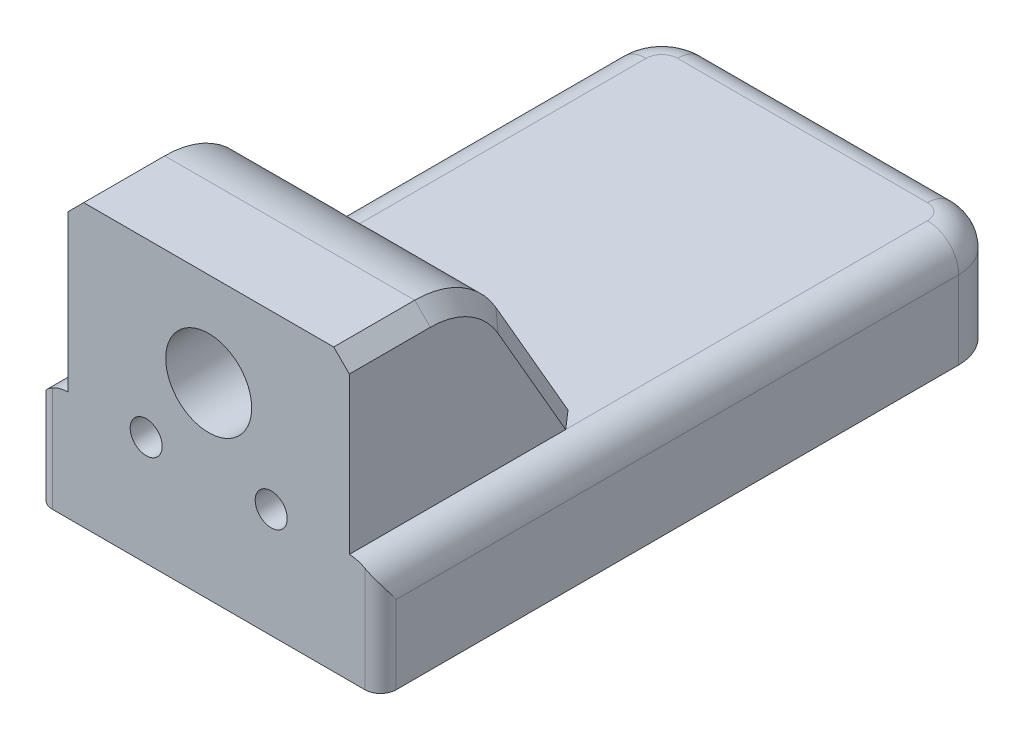
ISO-10303-21;
HEADER;
FILE_DESCRIPTION(('STEP AP214'),'2;1');
FILE_NAME('part.step','',(''),(''),'','','');
FILE_SCHEMA(('AUTOMOTIVE_DESIGN { 1 0 10303 214 1 1 1 1 }'));
ENDSEC;
DATA;
#1=APPLICATION_CONTEXT('core data for automotive mechanical design processes');
#2=APPLICATION_PROTOCOL_DEFINITION('international standard','automotive_design',2000,#1);
#3=PRODUCT_CONTEXT('',#1,'mechanical');
#4=PRODUCT('Part','Part','',(#3));
#5=PRODUCT_RELATED_PRODUCT_CATEGORY('part','',(#4));
#6=PRODUCT_DEFINITION_FORMATION('','',#4);
#7=PRODUCT_DEFINITION_CONTEXT('part definition',#1,'design');
#8=PRODUCT_DEFINITION('design','',#6,#7);
#9=PRODUCT_DEFINITION_SHAPE('','',#8);
#10=(LENGTH_UNIT() NAMED_UNIT(*) SI_UNIT(.MILLI.,.METRE.));
#11=(NAMED_UNIT(*) PLANE_ANGLE_UNIT() SI_UNIT($,.RADIAN.));
#12=(NAMED_UNIT(*) SI_UNIT($,.STERADIAN.) SOLID_ANGLE_UNIT());
#13=UNCERTAINTY_MEASURE_WITH_UNIT(LENGTH_MEASURE(1.E-05),#10,'distance_accuracy_value','');
#14=(GEOMETRIC_REPRESENTATION_CONTEXT(3) GLOBAL_UNCERTAINTY_ASSIGNED_CONTEXT((#13)) GLOBAL_UNIT_ASSIGNED_CONTEXT((#10,
#11,#12)) REPRESENTATION_CONTEXT('',''));
#15=CARTESIAN_POINT('',(0.,0.,0.));
#16=DIRECTION('',(0.,0.,1.));
#17=DIRECTION('',(1.,0.,0.));
#18=AXIS2_PLACEMENT_3D('',#15,#16,#17);
#19=CARTESIAN_POINT('',(0.,7.,0.));
#20=DIRECTION('',(0.,-1.,0.));
#21=DIRECTION('',(0.,0.,-1.));
#22=AXIS2_PLACEMENT_3D('',#19,#20,#21);
#23=PLANE('',#22);
#24=CARTESIAN_POINT('',(3.,7.,-37.));
#25=DIRECTION('',(0.,-1.,0.));
#26=DIRECTION('',(0.,0.,-1.));
#27=AXIS2_PLACEMENT_3D('',#24,#25,#26);
#28=CIRCLE('',#27,1.);
#29=CARTESIAN_POINT('',(3.,7.,-38.));
#30=VERTEX_POINT('',#29);
#31=CARTESIAN_POINT('',(2.,7.,-37.));
#32=VERTEX_POINT('',#31);
#33=EDGE_CURVE('E260',#30,#32,#28,.F.);
#34=ORIENTED_EDGE('',*,*,#33,.T.);
#35=DIRECTION('',(0.,0.,-1.));
#36=VECTOR('',#35,1.);
#37=CARTESIAN_POINT('',(2.,7.,0.));
#38=LINE('',#37,#36);
#39=CARTESIAN_POINT('',(2.,7.,-13.8452994616208));
#40=VERTEX_POINT('',#39);
#41=EDGE_CURVE('E193',#32,#40,#38,.F.);
#42=ORIENTED_EDGE('',*,*,#41,.T.);
#43=DIRECTION('',(0.654653670707983,0.,-0.755928946018449));
#44=VECTOR('',#43,1.);
#45=CARTESIAN_POINT('',(-5.70878917529523,7.,-4.94395645065536));
#46=LINE('',#45,#44);
#47=CARTESIAN_POINT('',(3.,7.,-15.));
#48=VERTEX_POINT('',#47);
#49=EDGE_CURVE('E470',#40,#48,#46,.T.);
#50=ORIENTED_EDGE('',*,*,#49,.T.);
#51=DIRECTION('',(-1.,0.,0.));
#52=VECTOR('',#51,1.);
#53=CARTESIAN_POINT('',(2.00000000000002,7.,-15.));
#54=LINE('',#53,#52);
#55=CARTESIAN_POINT('',(18.9999999999999,7.,-15.));
#56=VERTEX_POINT('',#55);
#57=EDGE_CURVE('E208',#56,#48,#54,.T.);
#58=ORIENTED_EDGE('',*,*,#57,.F.);
#59=DIRECTION('',(0.654653670707979,0.,0.755928946018453));
#60=VECTOR('',#59,1.);
#61=CARTESIAN_POINT('',(18.2802177467237,7.,-15.8311329553739));
#62=LINE('',#61,#60);
#63=CARTESIAN_POINT('',(19.9999999999999,7.,-13.8452994616208));
#64=VERTEX_POINT('',#63);
#65=EDGE_CURVE('E468',#56,#64,#62,.T.);
#66=ORIENTED_EDGE('',*,*,#65,.T.);
#67=DIRECTION('',(0.,0.,1.));
#68=VECTOR('',#67,1.);
#69=CARTESIAN_POINT('',(20.,7.,-37.));
#70=LINE('',#69,#68);
#71=CARTESIAN_POINT('',(20.,7.,-37.));
#72=VERTEX_POINT('',#71);
#73=EDGE_CURVE('E207',#64,#72,#70,.F.);
#74=ORIENTED_EDGE('',*,*,#73,.T.);
#75=CARTESIAN_POINT('',(19.,7.,-37.));
#76=DIRECTION('',(0.,-1.,0.));
#77=DIRECTION('',(0.,0.,-1.));
#78=AXIS2_PLACEMENT_3D('',#75,#76,#77);
#79=CIRCLE('',#78,1.);
#80=CARTESIAN_POINT('',(19.,7.,-38.));
#81=VERTEX_POINT('',#80);
#82=EDGE_CURVE('E256',#72,#81,#79,.F.);
#83=ORIENTED_EDGE('',*,*,#82,.T.);
#84=DIRECTION('',(1.,0.,0.));
#85=VECTOR('',#84,1.);
#86=CARTESIAN_POINT('',(3.,7.,-38.));
#87=LINE('',#86,#85);
#88=EDGE_CURVE('E258',#81,#30,#87,.F.);
#89=ORIENTED_EDGE('',*,*,#88,.T.);
#90=EDGE_LOOP('',(#34,#42,#50,#58,#66,#74,#83,#89));
#91=FACE_BOUND('',#90,.T.);
#92=ADVANCED_FACE('F39',(#91),#23,.F.);
#93=CARTESIAN_POINT('',(22.,7.,0.));
#94=DIRECTION('',(0.,0.,1.));
#95=DIRECTION('',(1.,0.,0.));
#96=AXIS2_PLACEMENT_3D('',#93,#94,#95);
#97=PLANE('',#96);
#98=CARTESIAN_POINT('',(11.,11.9999999999997,0.));
#99=DIRECTION('',(0.,0.,-1.));
#100=DIRECTION('',(-1.,0.,0.));
#101=AXIS2_PLACEMENT_3D('',#98,#99,#100);
#102=CIRCLE('',#101,2.75000000000001);
#103=CARTESIAN_POINT('',(8.24999999999999,11.9999999999997,0.));
#104=VERTEX_POINT('',#103);
#105=EDGE_CURVE('E238',#104,#104,#102,.T.);
#106=ORIENTED_EDGE('',*,*,#105,.T.);
#107=EDGE_LOOP('',(#106));
#108=FACE_BOUND('',#107,.T.);
#109=CARTESIAN_POINT('',(15.,7.,0.));
#110=DIRECTION('',(0.,0.,1.));
#111=DIRECTION('',(1.,0.,0.));
#112=AXIS2_PLACEMENT_3D('',#109,#110,#111);
#113=CIRCLE('',#112,1.02500000000002);
#114=CARTESIAN_POINT('',(16.025,7.,0.));
#115=VERTEX_POINT('',#114);
#116=EDGE_CURVE('E237',#115,#115,#113,.T.);
#117=ORIENTED_EDGE('',*,*,#116,.F.);
#118=EDGE_LOOP('',(#117));
#119=FACE_BOUND('',#118,.T.);
#120=CARTESIAN_POINT('',(7.,7.,0.));
#121=DIRECTION('',(0.,0.,1.));
#122=DIRECTION('',(1.,0.,0.));
#123=AXIS2_PLACEMENT_3D('',#120,#121,#122);
#124=CIRCLE('',#123,1.02500000000001);
#125=CARTESIAN_POINT('',(8.02500000000001,7.,0.));
#126=VERTEX_POINT('',#125);
#127=EDGE_CURVE('E215',#126,#126,#124,.T.);
#128=ORIENTED_EDGE('',*,*,#127,.F.);
#129=EDGE_LOOP('',(#128));
#130=FACE_BOUND('',#129,.T.);
#131=CARTESIAN_POINT('',(2.,5.,0.));
#132=DIRECTION('',(0.,0.,1.));
#133=DIRECTION('',(1.,0.,0.));
#134=AXIS2_PLACEMENT_3D('',#131,#132,#133);
#135=CIRCLE('',#134,2.);
#136=CARTESIAN_POINT('',(2.00000000000002,7.,0.));
#137=VERTEX_POINT('',#136);
#138=CARTESIAN_POINT('',(1.,6.73205080756888,0.));
#139=VERTEX_POINT('',#138);
#140=EDGE_CURVE('E192',#137,#139,#135,.T.);
#141=ORIENTED_EDGE('',*,*,#140,.T.);
#142=DIRECTION('',(0.,-1.,0.));
#143=VECTOR('',#142,1.);
#144=CARTESIAN_POINT('',(1.,7.,0.));
#145=LINE('',#144,#143);
#146=CARTESIAN_POINT('',(1.,0.,0.));
#147=VERTEX_POINT('',#146);
#148=EDGE_CURVE('E483',#139,#147,#145,.T.);
#149=ORIENTED_EDGE('',*,*,#148,.T.);
#150=DIRECTION('',(-1.,0.,0.));
#151=VECTOR('',#150,1.);
#152=CARTESIAN_POINT('',(22.,0.,0.));
#153=LINE('',#152,#151);
#154=CARTESIAN_POINT('',(21.,0.,0.));
#155=VERTEX_POINT('',#154);
#156=EDGE_CURVE('E222',#155,#147,#153,.T.);
#157=ORIENTED_EDGE('',*,*,#156,.F.);
#158=DIRECTION('',(0.,-1.,0.));
#159=VECTOR('',#158,1.);
#160=CARTESIAN_POINT('',(21.,7.,0.));
#161=LINE('',#160,#159);
#162=CARTESIAN_POINT('',(21.,6.73205080756888,0.));
#163=VERTEX_POINT('',#162);
#164=EDGE_CURVE('E190',#155,#163,#161,.F.);
#165=ORIENTED_EDGE('',*,*,#164,.T.);
#166=CARTESIAN_POINT('',(20.,5.,0.));
#167=DIRECTION('',(0.,0.,1.));
#168=DIRECTION('',(1.,0.,0.));
#169=AXIS2_PLACEMENT_3D('',#166,#167,#168);
#170=CIRCLE('',#169,2.);
#171=CARTESIAN_POINT('',(19.9999999999999,7.,0.));
#172=VERTEX_POINT('',#171);
#173=EDGE_CURVE('E182',#163,#172,#170,.T.);
#174=ORIENTED_EDGE('',*,*,#173,.T.);
#175=DIRECTION('',(0.,-1.,0.));
#176=VECTOR('',#175,1.);
#177=CARTESIAN_POINT('',(19.9999999999999,17.9999999999996,0.));
#178=LINE('',#177,#176);
#179=CARTESIAN_POINT('',(19.9999999999999,16.9999999999996,0.));
#180=VERTEX_POINT('',#179);
#181=EDGE_CURVE('E186',#180,#172,#178,.T.);
#182=ORIENTED_EDGE('',*,*,#181,.F.);
#183=DIRECTION('',(0.70710678118655,-0.707106781186545,0.));
#184=VECTOR('',#183,1.);
#185=CARTESIAN_POINT('',(25.9999999999997,10.9999999999998,0.));
#186=LINE('',#185,#184);
#187=CARTESIAN_POINT('',(18.9999999999999,17.9999999999996,0.));
#188=VERTEX_POINT('',#187);
#189=EDGE_CURVE('E442',#180,#188,#186,.F.);
#190=ORIENTED_EDGE('',*,*,#189,.T.);
#191=DIRECTION('',(1.,0.,0.));
#192=VECTOR('',#191,1.);
#193=CARTESIAN_POINT('',(19.9999999999999,17.9999999999996,0.));
#194=LINE('',#193,#192);
#195=CARTESIAN_POINT('',(3.,17.9999999999996,0.));
#196=VERTEX_POINT('',#195);
#197=EDGE_CURVE('E203',#196,#188,#194,.T.);
#198=ORIENTED_EDGE('',*,*,#197,.F.);
#199=DIRECTION('',(0.707106781186554,0.707106781186541,0.));
#200=VECTOR('',#199,1.);
#201=CARTESIAN_POINT('',(7.00000000000038,21.9999999999999,0.));
#202=LINE('',#201,#200);
#203=CARTESIAN_POINT('',(2.00000000000002,16.9999999999996,0.));
#204=VERTEX_POINT('',#203);
#205=EDGE_CURVE('E449',#196,#204,#202,.F.);
#206=ORIENTED_EDGE('',*,*,#205,.T.);
#207=DIRECTION('',(0.,-1.,0.));
#208=VECTOR('',#207,1.);
#209=CARTESIAN_POINT('',(2.00000000000002,17.9999999999996,0.));
#210=LINE('',#209,#208);
#211=EDGE_CURVE('E202',#204,#137,#210,.T.);
#212=ORIENTED_EDGE('',*,*,#211,.T.);
#213=EDGE_LOOP('',(#141,#149,#157,#165,#174,#182,#190,#198,#206,#212));
#214=FACE_BOUND('',#213,.T.);
#215=ADVANCED_FACE('F185',(#108,#119,#130,#214),#97,.T.);
#216=CARTESIAN_POINT('',(22.,7.,-40.));
#217=DIRECTION('',(1.,0.,0.));
#218=DIRECTION('',(0.,0.,-1.));
#219=AXIS2_PLACEMENT_3D('',#216,#217,#218);
#220=PLANE('',#219);
#221=DIRECTION('',(0.,0.,1.));
#222=VECTOR('',#221,1.);
#223=CARTESIAN_POINT('',(22.,5.,0.));
#224=LINE('',#223,#222);
#225=CARTESIAN_POINT('',(22.,5.,-37.));
#226=VERTEX_POINT('',#225);
#227=CARTESIAN_POINT('',(22.,5.,-1.));
#228=VERTEX_POINT('',#227);
#229=EDGE_CURVE('E270',#226,#228,#224,.T.);
#230=ORIENTED_EDGE('',*,*,#229,.T.);
#231=DIRECTION('',(0.,-1.,0.));
#232=VECTOR('',#231,1.);
#233=CARTESIAN_POINT('',(22.,7.,-1.));
#234=LINE('',#233,#232);
#235=CARTESIAN_POINT('',(22.,0.,-1.));
#236=VERTEX_POINT('',#235);
#237=EDGE_CURVE('E53',#228,#236,#234,.T.);
#238=ORIENTED_EDGE('',*,*,#237,.T.);
#239=DIRECTION('',(0.,0.,1.));
#240=VECTOR('',#239,1.);
#241=CARTESIAN_POINT('',(22.,0.,-40.));
#242=LINE('',#241,#240);
#243=CARTESIAN_POINT('',(22.,0.,-37.));
#244=VERTEX_POINT('',#243);
#245=EDGE_CURVE('E230',#244,#236,#242,.T.);
#246=ORIENTED_EDGE('',*,*,#245,.F.);
#247=DIRECTION('',(0.,-1.,0.));
#248=VECTOR('',#247,1.);
#249=CARTESIAN_POINT('',(22.,7.,-37.));
#250=LINE('',#249,#248);
#251=EDGE_CURVE('E247',#244,#226,#250,.F.);
#252=ORIENTED_EDGE('',*,*,#251,.T.);
#253=EDGE_LOOP('',(#230,#238,#246,#252));
#254=FACE_BOUND('',#253,.T.);
#255=ADVANCED_FACE('F356',(#254),#220,.T.);
#256=CARTESIAN_POINT('',(0.,7.,-40.));
#257=DIRECTION('',(0.,0.,-1.));
#258=DIRECTION('',(-1.,0.,0.));
#259=AXIS2_PLACEMENT_3D('',#256,#257,#258);
#260=PLANE('',#259);
#261=DIRECTION('',(0.,-1.,0.));
#262=VECTOR('',#261,1.);
#263=CARTESIAN_POINT('',(3.,7.,-40.));
#264=LINE('',#263,#262);
#265=CARTESIAN_POINT('',(3.,0.,-40.));
#266=VERTEX_POINT('',#265);
#267=CARTESIAN_POINT('',(3.,5.,-40.));
#268=VERTEX_POINT('',#267);
#269=EDGE_CURVE('E233',#266,#268,#264,.F.);
#270=ORIENTED_EDGE('',*,*,#269,.T.);
#271=DIRECTION('',(1.,0.,0.));
#272=VECTOR('',#271,1.);
#273=CARTESIAN_POINT('',(19.,5.,-40.));
#274=LINE('',#273,#272);
#275=CARTESIAN_POINT('',(19.,5.,-40.));
#276=VERTEX_POINT('',#275);
#277=EDGE_CURVE('E266',#268,#276,#274,.T.);
#278=ORIENTED_EDGE('',*,*,#277,.T.);
#279=DIRECTION('',(0.,-1.,0.));
#280=VECTOR('',#279,1.);
#281=CARTESIAN_POINT('',(19.,7.,-40.));
#282=LINE('',#281,#280);
#283=CARTESIAN_POINT('',(19.,0.,-40.));
#284=VERTEX_POINT('',#283);
#285=EDGE_CURVE('E241',#276,#284,#282,.T.);
#286=ORIENTED_EDGE('',*,*,#285,.T.);
#287=DIRECTION('',(1.,0.,0.));
#288=VECTOR('',#287,1.);
#289=CARTESIAN_POINT('',(0.,0.,-40.));
#290=LINE('',#289,#288);
#291=EDGE_CURVE('E227',#266,#284,#290,.T.);
#292=ORIENTED_EDGE('',*,*,#291,.F.);
#293=EDGE_LOOP('',(#270,#278,#286,#292));
#294=FACE_BOUND('',#293,.T.);
#295=ADVANCED_FACE('F359',(#294),#260,.T.);
#296=CARTESIAN_POINT('',(0.,7.,0.));
#297=DIRECTION('',(-1.,0.,0.));
#298=DIRECTION('',(0.,0.,1.));
#299=AXIS2_PLACEMENT_3D('',#296,#297,#298);
#300=PLANE('',#299);
#301=DIRECTION('',(0.,0.,-1.));
#302=VECTOR('',#301,1.);
#303=CARTESIAN_POINT('',(0.,0.,0.));
#304=LINE('',#303,#302);
#305=CARTESIAN_POINT('',(0.,0.,-1.));
#306=VERTEX_POINT('',#305);
#307=CARTESIAN_POINT('',(0.,0.,-37.));
#308=VERTEX_POINT('',#307);
#309=EDGE_CURVE('E225',#306,#308,#304,.T.);
#310=ORIENTED_EDGE('',*,*,#309,.F.);
#311=DIRECTION('',(0.,-1.,0.));
#312=VECTOR('',#311,1.);
#313=CARTESIAN_POINT('',(0.,7.,-1.));
#314=LINE('',#313,#312);
#315=CARTESIAN_POINT('',(0.,5.,-1.));
#316=VERTEX_POINT('',#315);
#317=EDGE_CURVE('E66',#306,#316,#314,.F.);
#318=ORIENTED_EDGE('',*,*,#317,.T.);
#319=DIRECTION('',(0.,0.,-1.));
#320=VECTOR('',#319,1.);
#321=CARTESIAN_POINT('',(0.,5.,-37.));
#322=LINE('',#321,#320);
#323=CARTESIAN_POINT('',(0.,5.,-37.));
#324=VERTEX_POINT('',#323);
#325=EDGE_CURVE('E253',#316,#324,#322,.T.);
#326=ORIENTED_EDGE('',*,*,#325,.T.);
#327=DIRECTION('',(0.,-1.,0.));
#328=VECTOR('',#327,1.);
#329=CARTESIAN_POINT('',(0.,7.,-37.));
#330=LINE('',#329,#328);
#331=EDGE_CURVE('E250',#324,#308,#330,.T.);
#332=ORIENTED_EDGE('',*,*,#331,.T.);
#333=EDGE_LOOP('',(#310,#318,#326,#332));
#334=FACE_BOUND('',#333,.T.);
#335=ADVANCED_FACE('F354',(#334),#300,.T.);
#336=CARTESIAN_POINT('',(0.,0.,0.));
#337=DIRECTION('',(0.,-1.,0.));
#338=DIRECTION('',(0.,0.,-1.));
#339=AXIS2_PLACEMENT_3D('',#336,#337,#338);
#340=PLANE('',#339);
#341=ORIENTED_EDGE('',*,*,#156,.T.);
#342=CARTESIAN_POINT('',(1.,0.,-1.));
#343=DIRECTION('',(0.,-1.,0.));
#344=DIRECTION('',(0.,0.,-1.));
#345=AXIS2_PLACEMENT_3D('',#342,#343,#344);
#346=CIRCLE('',#345,1.);
#347=EDGE_CURVE('E487',#147,#306,#346,.T.);
#348=ORIENTED_EDGE('',*,*,#347,.T.);
#349=ORIENTED_EDGE('',*,*,#309,.T.);
#350=CARTESIAN_POINT('',(3.,0.,-37.));
#351=DIRECTION('',(0.,-1.,0.));
#352=DIRECTION('',(0.,0.,-1.));
#353=AXIS2_PLACEMENT_3D('',#350,#351,#352);
#354=CIRCLE('',#353,3.);
#355=EDGE_CURVE('E243',#308,#266,#354,.T.);
#356=ORIENTED_EDGE('',*,*,#355,.T.);
#357=ORIENTED_EDGE('',*,*,#291,.T.);
#358=CARTESIAN_POINT('',(19.,0.,-37.));
#359=DIRECTION('',(0.,-1.,0.));
#360=DIRECTION('',(0.,0.,-1.));
#361=AXIS2_PLACEMENT_3D('',#358,#359,#360);
#362=CIRCLE('',#361,3.);
#363=EDGE_CURVE('E245',#284,#244,#362,.T.);
#364=ORIENTED_EDGE('',*,*,#363,.T.);
#365=ORIENTED_EDGE('',*,*,#245,.T.);
#366=CARTESIAN_POINT('',(21.,0.,-1.));
#367=DIRECTION('',(0.,-1.,0.));
#368=DIRECTION('',(0.,0.,-1.));
#369=AXIS2_PLACEMENT_3D('',#366,#367,#368);
#370=CIRCLE('',#369,1.);
#371=EDGE_CURVE('E486',#236,#155,#370,.T.);
#372=ORIENTED_EDGE('',*,*,#371,.T.);
#373=EDGE_LOOP('',(#341,#348,#349,#356,#357,#364,#365,#372));
#374=FACE_BOUND('',#373,.T.);
#375=ADVANCED_FACE('F348',(#374),#340,.T.);
#376=CARTESIAN_POINT('',(19.9999999999999,17.9999999999996,-15.));
#377=DIRECTION('',(-1.,0.,0.));
#378=DIRECTION('',(0.,0.,1.));
#379=AXIS2_PLACEMENT_3D('',#376,#377,#378);
#380=PLANE('',#379);
#381=CARTESIAN_POINT('',(19.9999999999999,11.9999999999996,-5.18504542377656));
#382=DIRECTION('',(-1.,0.,0.));
#383=DIRECTION('',(0.,0.,1.));
#384=AXIS2_PLACEMENT_3D('',#381,#382,#383);
#385=CIRCLE('',#384,5.00000000000002);
#386=CARTESIAN_POINT('',(19.9999999999999,14.4999999999996,-9.51517244269876));
#387=VERTEX_POINT('',#386);
#388=CARTESIAN_POINT('',(19.9999999999999,16.9999999999996,-5.18504542377656));
#389=VERTEX_POINT('',#388);
#390=EDGE_CURVE('E515',#387,#389,#385,.F.);
#391=ORIENTED_EDGE('',*,*,#390,.T.);
#392=DIRECTION('',(0.,0.,1.));
#393=VECTOR('',#392,1.);
#394=CARTESIAN_POINT('',(19.9999999999999,16.9999999999996,-15.));
#395=LINE('',#394,#393);
#396=EDGE_CURVE('E201',#389,#180,#395,.T.);
#397=ORIENTED_EDGE('',*,*,#396,.T.);
#398=ORIENTED_EDGE('',*,*,#181,.T.);
#399=DIRECTION('',(0.,0.,-1.));
#400=VECTOR('',#399,1.);
#401=CARTESIAN_POINT('',(19.9999999999999,7.,-15.));
#402=LINE('',#401,#400);
#403=EDGE_CURVE('E198',#172,#64,#402,.T.);
#404=ORIENTED_EDGE('',*,*,#403,.T.);
#405=DIRECTION('',(0.,0.866025403784436,0.500000000000004));
#406=VECTOR('',#405,1.);
#407=CARTESIAN_POINT('',(19.9999999999999,14.7499999999996,-9.37083487540133));
#408=LINE('',#407,#406);
#409=EDGE_CURVE('E516',#64,#387,#408,.T.);
#410=ORIENTED_EDGE('',*,*,#409,.T.);
#411=EDGE_LOOP('',(#391,#397,#398,#404,#410));
#412=FACE_BOUND('',#411,.T.);
#413=ADVANCED_FACE('F197',(#412),#380,.F.);
#414=CARTESIAN_POINT('',(2.00000000000002,7.,-15.));
#415=DIRECTION('',(0.,0.500000000000004,-0.866025403784436));
#416=DIRECTION('',(0.,0.866025403784436,0.500000000000004));
#417=AXIS2_PLACEMENT_3D('',#414,#415,#416);
#418=PLANE('',#417);
#419=DIRECTION('',(-1.,0.,0.));
#420=VECTOR('',#419,1.);
#421=CARTESIAN_POINT('',(2.00000000000002,14.9999999999996,-10.3811978464832));
#422=LINE('',#421,#420);
#423=CARTESIAN_POINT('',(14.35410196625,14.9999999999996,-10.3811978464832));
#424=VERTEX_POINT('',#423);
#425=CARTESIAN_POINT('',(18.9999999999999,14.9999999999996,-10.3811978464832));
#426=VERTEX_POINT('',#425);
#427=EDGE_CURVE('E289',#424,#426,#422,.F.);
#428=ORIENTED_EDGE('',*,*,#427,.T.);
#429=DIRECTION('',(0.,0.866025403784436,0.500000000000004));
#430=VECTOR('',#429,1.);
#431=CARTESIAN_POINT('',(18.9999999999999,7.,-15.));
#432=LINE('',#431,#430);
#433=EDGE_CURVE('E451',#426,#56,#432,.F.);
#434=ORIENTED_EDGE('',*,*,#433,.T.);
#435=ORIENTED_EDGE('',*,*,#57,.T.);
#436=DIRECTION('',(0.,-0.866025403784436,-0.500000000000004));
#437=VECTOR('',#436,1.);
#438=CARTESIAN_POINT('',(3.,7.,-15.));
#439=LINE('',#438,#437);
#440=CARTESIAN_POINT('',(3.,14.9999999999996,-10.3811978464832));
#441=VERTEX_POINT('',#440);
#442=EDGE_CURVE('E448',#48,#441,#439,.F.);
#443=ORIENTED_EDGE('',*,*,#442,.T.);
#444=DIRECTION('',(-1.,0.,0.));
#445=VECTOR('',#444,1.);
#446=CARTESIAN_POINT('',(2.00000000000002,14.9999999999996,-10.3811978464832));
#447=LINE('',#446,#445);
#448=CARTESIAN_POINT('',(7.64589803374995,14.9999999999996,-10.3811978464832));
#449=VERTEX_POINT('',#448);
#450=EDGE_CURVE('E292',#441,#449,#447,.F.);
#451=ORIENTED_EDGE('',*,*,#450,.T.);
#452=CARTESIAN_POINT('',(11.,11.9999999999997,-12.113248654052));
#453=DIRECTION('',(0.,0.500000000000004,-0.866025403784436));
#454=DIRECTION('',(0.,-0.866025403784436,-0.500000000000004));
#455=AXIS2_PLACEMENT_3D('',#452,#453,#454);
#456=ELLIPSE('',#455,5.19615242270686,4.50000000000019);
#457=EDGE_CURVE('E234',#449,#424,#456,.F.);
#458=ORIENTED_EDGE('',*,*,#457,.T.);
#459=EDGE_LOOP('',(#428,#434,#435,#443,#451,#458));
#460=FACE_BOUND('',#459,.T.);
#461=ADVANCED_FACE('F344',(#460),#418,.T.);
#462=CARTESIAN_POINT('',(2.00000000000002,17.9999999999996,0.));
#463=DIRECTION('',(1.,0.,0.));
#464=DIRECTION('',(0.,0.,-1.));
#465=AXIS2_PLACEMENT_3D('',#462,#463,#464);
#466=PLANE('',#465);
#467=ORIENTED_EDGE('',*,*,#211,.F.);
#468=DIRECTION('',(0.,0.,-1.));
#469=VECTOR('',#468,1.);
#470=CARTESIAN_POINT('',(2.00000000000002,16.9999999999996,0.));
#471=LINE('',#470,#469);
#472=CARTESIAN_POINT('',(2.00000000000002,16.9999999999996,-5.18504542377656));
#473=VERTEX_POINT('',#472);
#474=EDGE_CURVE('E466',#204,#473,#471,.T.);
#475=ORIENTED_EDGE('',*,*,#474,.T.);
#476=CARTESIAN_POINT('',(2.00000000000002,11.9999999999996,-5.18504542377656));
#477=DIRECTION('',(1.,0.,0.));
#478=DIRECTION('',(0.,0.,-1.));
#479=AXIS2_PLACEMENT_3D('',#476,#477,#478);
#480=CIRCLE('',#479,5.00000000000004);
#481=CARTESIAN_POINT('',(2.00000000000002,14.4999999999996,-9.51517244269877));
#482=VERTEX_POINT('',#481);
#483=EDGE_CURVE('E464',#473,#482,#480,.F.);
#484=ORIENTED_EDGE('',*,*,#483,.T.);
#485=DIRECTION('',(0.,-0.866025403784436,-0.500000000000004));
#486=VECTOR('',#485,1.);
#487=CARTESIAN_POINT('',(2.00000000000002,21.245190528383,-5.62083487540128));
#488=LINE('',#487,#486);
#489=EDGE_CURVE('E461',#482,#40,#488,.T.);
#490=ORIENTED_EDGE('',*,*,#489,.T.);
#491=DIRECTION('',(0.,0.,1.));
#492=VECTOR('',#491,1.);
#493=CARTESIAN_POINT('',(2.00000000000002,7.,0.));
#494=LINE('',#493,#492);
#495=EDGE_CURVE('E212',#40,#137,#494,.T.);
#496=ORIENTED_EDGE('',*,*,#495,.T.);
#497=EDGE_LOOP('',(#467,#475,#484,#490,#496));
#498=FACE_BOUND('',#497,.T.);
#499=ADVANCED_FACE('F340',(#498),#466,.F.);
#500=CARTESIAN_POINT('',(0.,17.9999999999996,0.));
#501=DIRECTION('',(0.,-1.,0.));
#502=DIRECTION('',(0.,0.,-1.));
#503=AXIS2_PLACEMENT_3D('',#500,#501,#502);
#504=PLANE('',#503);
#505=ORIENTED_EDGE('',*,*,#197,.T.);
#506=DIRECTION('',(0.,0.,-1.));
#507=VECTOR('',#506,1.);
#508=CARTESIAN_POINT('',(18.9999999999999,17.9999999999996,0.));
#509=LINE('',#508,#507);
#510=CARTESIAN_POINT('',(18.9999999999999,17.9999999999996,-5.18504542377656));
#511=VERTEX_POINT('',#510);
#512=EDGE_CURVE('E445',#188,#511,#509,.T.);
#513=ORIENTED_EDGE('',*,*,#512,.T.);
#514=DIRECTION('',(1.,0.,0.));
#515=VECTOR('',#514,1.);
#516=CARTESIAN_POINT('',(0.,17.9999999999996,-5.18504542377656));
#517=LINE('',#516,#515);
#518=CARTESIAN_POINT('',(3.,17.9999999999996,-5.18504542377656));
#519=VERTEX_POINT('',#518);
#520=EDGE_CURVE('E272',#511,#519,#517,.F.);
#521=ORIENTED_EDGE('',*,*,#520,.T.);
#522=DIRECTION('',(0.,0.,1.));
#523=VECTOR('',#522,1.);
#524=CARTESIAN_POINT('',(3.,17.9999999999996,0.));
#525=LINE('',#524,#523);
#526=EDGE_CURVE('E302',#519,#196,#525,.T.);
#527=ORIENTED_EDGE('',*,*,#526,.T.);
#528=EDGE_LOOP('',(#505,#513,#521,#527));
#529=FACE_BOUND('',#528,.T.);
#530=ADVANCED_FACE('F336',(#529),#504,.F.);
#531=CARTESIAN_POINT('',(7.,7.,-5.));
#532=DIRECTION('',(0.,0.,-1.));
#533=DIRECTION('',(-1.,0.,0.));
#534=AXIS2_PLACEMENT_3D('',#531,#532,#533);
#535=PLANE('',#534);
#536=CARTESIAN_POINT('',(7.,7.,-5.));
#537=DIRECTION('',(0.,0.,1.));
#538=DIRECTION('',(1.,0.,0.));
#539=AXIS2_PLACEMENT_3D('',#536,#537,#538);
#540=CIRCLE('',#539,1.02500000000001);
#541=CARTESIAN_POINT('',(8.02500000000001,7.,-5.));
#542=VERTEX_POINT('',#541);
#543=EDGE_CURVE('E209',#542,#542,#540,.T.);
#544=ORIENTED_EDGE('',*,*,#543,.T.);
#545=EDGE_LOOP('',(#544));
#546=FACE_BOUND('',#545,.T.);
#547=ADVANCED_FACE('F332',(#546),#535,.F.);
#548=CARTESIAN_POINT('',(7.,7.,0.));
#549=DIRECTION('',(0.,0.,1.));
#550=DIRECTION('',(1.,0.,0.));
#551=AXIS2_PLACEMENT_3D('',#548,#549,#550);
#552=CYLINDRICAL_SURFACE('',#551,1.02500000000001);
#553=ORIENTED_EDGE('',*,*,#543,.F.);
#554=EDGE_LOOP('',(#553));
#555=FACE_BOUND('',#554,.T.);
#556=ORIENTED_EDGE('',*,*,#127,.T.);
#557=EDGE_LOOP('',(#556));
#558=FACE_BOUND('',#557,.T.);
#559=ADVANCED_FACE('F328',(#555,#558),#552,.F.);
#560=CARTESIAN_POINT('',(15.,7.,-5.));
#561=DIRECTION('',(0.,0.,-1.));
#562=DIRECTION('',(-1.,0.,0.));
#563=AXIS2_PLACEMENT_3D('',#560,#561,#562);
#564=PLANE('',#563);
#565=CARTESIAN_POINT('',(15.,7.,-5.));
#566=DIRECTION('',(0.,0.,1.));
#567=DIRECTION('',(1.,0.,0.));
#568=AXIS2_PLACEMENT_3D('',#565,#566,#567);
#569=CIRCLE('',#568,1.02500000000002);
#570=CARTESIAN_POINT('',(16.025,7.,-5.));
#571=VERTEX_POINT('',#570);
#572=EDGE_CURVE('E767',#571,#571,#569,.T.);
#573=ORIENTED_EDGE('',*,*,#572,.T.);
#574=EDGE_LOOP('',(#573));
#575=FACE_BOUND('',#574,.T.);
#576=ADVANCED_FACE('F324',(#575),#564,.F.);
#577=CARTESIAN_POINT('',(15.,7.,0.));
#578=DIRECTION('',(0.,0.,1.));
#579=DIRECTION('',(1.,0.,0.));
#580=AXIS2_PLACEMENT_3D('',#577,#578,#579);
#581=CYLINDRICAL_SURFACE('',#580,1.02500000000002);
#582=ORIENTED_EDGE('',*,*,#572,.F.);
#583=EDGE_LOOP('',(#582));
#584=FACE_BOUND('',#583,.T.);
#585=ORIENTED_EDGE('',*,*,#116,.T.);
#586=EDGE_LOOP('',(#585));
#587=FACE_BOUND('',#586,.T.);
#588=ADVANCED_FACE('F312',(#584,#587),#581,.F.);
#589=CARTESIAN_POINT('',(11.,11.9999999999997,-14.7113248654051));
#590=DIRECTION('',(0.,0.,-1.));
#591=DIRECTION('',(-1.,0.,0.));
#592=AXIS2_PLACEMENT_3D('',#589,#590,#591);
#593=CYLINDRICAL_SURFACE('',#592,4.50000000000019);
#594=CARTESIAN_POINT('',(11.,11.9999999999997,-4.));
#595=DIRECTION('',(0.,0.,-1.));
#596=DIRECTION('',(-1.,0.,0.));
#597=AXIS2_PLACEMENT_3D('',#594,#595,#596);
#598=CIRCLE('',#597,4.50000000000019);
#599=CARTESIAN_POINT('',(6.49999999999981,11.9999999999997,-4.));
#600=VERTEX_POINT('',#599);
#601=EDGE_CURVE('E286',#600,#600,#598,.T.);
#602=ORIENTED_EDGE('',*,*,#601,.F.);
#603=EDGE_LOOP('',(#602));
#604=FACE_BOUND('',#603,.T.);
#605=ORIENTED_EDGE('',*,*,#457,.F.);
#606=CARTESIAN_POINT('',(7.64589803374995,14.9999999999996,-10.3811978464832));
#607=CARTESIAN_POINT('',(7.73445692566533,15.0989739422942,-10.3240715687031));
#608=CARTESIAN_POINT('',(7.82696620526997,15.1936203609714,-10.2656414638531));
#609=CARTESIAN_POINT('',(8.01961107764753,15.3741333600842,-10.147586892106));
#610=CARTESIAN_POINT('',(8.11975109206973,15.4599947814848,-10.0879617477143));
#611=CARTESIAN_POINT('',(8.32842545468862,15.6235959877449,-9.96834317621836));
#612=CARTESIAN_POINT('',(8.43704033804651,15.7012355363288,-9.90835296075578));
#613=CARTESIAN_POINT('',(8.66146939603994,15.846969096802,-9.79043591224683));
#614=CARTESIAN_POINT('',(8.77728104258327,15.9150664336409,-9.73250836574497));
#615=CARTESIAN_POINT('',(9.07646683497233,16.0732548150763,-9.59238513351226));
#616=CARTESIAN_POINT('',(9.26442977648154,16.1570905136894,-9.51270382299306));
#617=CARTESIAN_POINT('',(9.65544148341165,16.2994341204748,-9.37132798212039));
#618=CARTESIAN_POINT('',(9.85842094797896,16.3580507958311,-9.30955659213099));
#619=CARTESIAN_POINT('',(10.2339631451058,16.4375705371067,-9.22369558072508));
#620=CARTESIAN_POINT('',(10.4041950636265,16.4637508109294,-9.19446875908493));
#621=CARTESIAN_POINT('',(10.7488269441074,16.4963065803066,-9.15793825822882));
#622=CARTESIAN_POINT('',(10.9232222439422,16.50270326933,-9.15061111892502));
#623=CARTESIAN_POINT('',(11.2710263999722,16.495200235171,-9.15911023099477));
#624=CARTESIAN_POINT('',(11.4444349434941,16.4812944030575,-9.17494345121183));
#625=CARTESIAN_POINT('',(11.7855317154745,16.4342640378859,-9.22713454279544));
#626=CARTESIAN_POINT('',(11.9532105681801,16.4011094654665,-9.26352449235395));
#627=CARTESIAN_POINT('',(12.3409907245674,16.3018015173853,-9.36851655526391));
#628=CARTESIAN_POINT('',(12.5571834955507,16.2279373829757,-9.44408002741059));
#629=CARTESIAN_POINT('',(12.9710083055908,16.0516679289669,-9.61209944900051));
#630=CARTESIAN_POINT('',(13.1685737291718,15.9491650106602,-9.7046127843958));
#631=CARTESIAN_POINT('',(13.4496685956451,15.7763877917211,-9.84814700932359));
#632=CARTESIAN_POINT('',(13.5406238077481,15.7157935378206,-9.89666325781897));
#633=CARTESIAN_POINT('',(13.7176537241421,15.5883503133547,-9.99442977472644));
#634=CARTESIAN_POINT('',(13.8037284737115,15.5215014008321,-10.0436800363234));
#635=CARTESIAN_POINT('',(13.9701644713854,15.3822773478558,-10.1415949399068));
#636=CARTESIAN_POINT('',(14.0505674575281,15.3099530614525,-10.1902610362096));
#637=CARTESIAN_POINT('',(14.20623720817,15.1593896704216,-10.2866396265357));
#638=CARTESIAN_POINT('',(14.2815040627124,15.0811506695377,-10.3343521372662));
#639=CARTESIAN_POINT('',(14.35410196625,14.9999999999996,-10.3811978464832));
#640=B_SPLINE_CURVE_WITH_KNOTS('',3,(#606,#607,#608,#609,#610,#611,#612,#613,#614,#615,#616,
#617,#618,#619,#620,#621,#622,#623,#624,#625,#626,#627,#628,#629,#630,#631,#632,#633,#634,#635,
#636,#637,#638,#639),.UNSPECIFIED.,.F.,.F.,(4,2,2,2,2,2,2,2,2,2,2,2,2,2,2,2,4),(0.,
0.433560273190248,0.867373712895661,1.30598115038438,1.74443537460142,2.40426816317569,
3.06122591297106,3.58306020976971,4.10433528959168,4.62576725090721,5.14801514862587,
5.86601420080357,6.58649062599813,6.94500603547347,7.30351811828486,7.65903397140571,
8.01454359025086),.UNSPECIFIED.);
#641=EDGE_CURVE('E294',#449,#424,#640,.T.);
#642=ORIENTED_EDGE('',*,*,#641,.T.);
#643=EDGE_LOOP('',(#605,#642));
#644=FACE_BOUND('',#643,.T.);
#645=ADVANCED_FACE('F307',(#604,#644),#593,.F.);
#646=CARTESIAN_POINT('',(11.,11.9999999999997,-14.7113248654051));
#647=DIRECTION('',(0.,0.,-1.));
#648=DIRECTION('',(-1.,0.,0.));
#649=AXIS2_PLACEMENT_3D('',#646,#647,#648);
#650=CYLINDRICAL_SURFACE('',#649,2.75000000000001);
#651=ORIENTED_EDGE('',*,*,#105,.F.);
#652=EDGE_LOOP('',(#651));
#653=FACE_BOUND('',#652,.T.);
#654=CARTESIAN_POINT('',(11.,11.9999999999997,-4.));
#655=DIRECTION('',(0.,0.,-1.));
#656=DIRECTION('',(-1.,0.,0.));
#657=AXIS2_PLACEMENT_3D('',#654,#655,#656);
#658=CIRCLE('',#657,2.75000000000001);
#659=CARTESIAN_POINT('',(8.24999999999999,11.9999999999997,-4.));
#660=VERTEX_POINT('',#659);
#661=EDGE_CURVE('E774',#660,#660,#658,.T.);
#662=ORIENTED_EDGE('',*,*,#661,.T.);
#663=EDGE_LOOP('',(#662));
#664=FACE_BOUND('',#663,.T.);
#665=ADVANCED_FACE('F311',(#653,#664),#650,.F.);
#666=CARTESIAN_POINT('',(13.75,11.9999999999997,-4.));
#667=DIRECTION('',(0.,0.,1.));
#668=DIRECTION('',(1.,0.,0.));
#669=AXIS2_PLACEMENT_3D('',#666,#667,#668);
#670=PLANE('',#669);
#671=ORIENTED_EDGE('',*,*,#661,.F.);
#672=EDGE_LOOP('',(#671));
#673=FACE_BOUND('',#672,.T.);
#674=ORIENTED_EDGE('',*,*,#601,.T.);
#675=EDGE_LOOP('',(#674));
#676=FACE_BOUND('',#675,.T.);
#677=ADVANCED_FACE('F314',(#673,#676),#670,.F.);
#678=CARTESIAN_POINT('',(19.,7.,-37.));
#679=DIRECTION('',(0.,-1.,0.));
#680=DIRECTION('',(0.,0.,-1.));
#681=AXIS2_PLACEMENT_3D('',#678,#679,#680);
#682=CYLINDRICAL_SURFACE('',#681,3.);
#683=ORIENTED_EDGE('',*,*,#285,.F.);
#684=CARTESIAN_POINT('',(19.,5.,-37.));
#685=DIRECTION('',(0.,-1.,0.));
#686=DIRECTION('',(0.,0.,-1.));
#687=AXIS2_PLACEMENT_3D('',#684,#685,#686);
#688=CIRCLE('',#687,3.);
#689=EDGE_CURVE('E268',#276,#226,#688,.T.);
#690=ORIENTED_EDGE('',*,*,#689,.T.);
#691=ORIENTED_EDGE('',*,*,#251,.F.);
#692=ORIENTED_EDGE('',*,*,#363,.F.);
#693=EDGE_LOOP('',(#683,#690,#691,#692));
#694=FACE_BOUND('',#693,.T.);
#695=ADVANCED_FACE('F317',(#694),#682,.T.);
#696=CARTESIAN_POINT('',(3.,7.,-37.));
#697=DIRECTION('',(0.,-1.,0.));
#698=DIRECTION('',(0.,0.,-1.));
#699=AXIS2_PLACEMENT_3D('',#696,#697,#698);
#700=CYLINDRICAL_SURFACE('',#699,3.);
#701=ORIENTED_EDGE('',*,*,#331,.F.);
#702=CARTESIAN_POINT('',(3.,5.,-37.));
#703=DIRECTION('',(0.,-1.,0.));
#704=DIRECTION('',(0.,0.,-1.));
#705=AXIS2_PLACEMENT_3D('',#702,#703,#704);
#706=CIRCLE('',#705,3.);
#707=EDGE_CURVE('E264',#324,#268,#706,.T.);
#708=ORIENTED_EDGE('',*,*,#707,.T.);
#709=ORIENTED_EDGE('',*,*,#269,.F.);
#710=ORIENTED_EDGE('',*,*,#355,.F.);
#711=EDGE_LOOP('',(#701,#708,#709,#710));
#712=FACE_BOUND('',#711,.T.);
#713=ADVANCED_FACE('F374',(#712),#700,.T.);
#714=CARTESIAN_POINT('',(20.,5.,-40.));
#715=DIRECTION('',(0.,0.,-1.));
#716=DIRECTION('',(-1.,0.,0.));
#717=AXIS2_PLACEMENT_3D('',#714,#715,#716);
#718=CYLINDRICAL_SURFACE('',#717,2.);
#719=ORIENTED_EDGE('',*,*,#173,.F.);
#720=CARTESIAN_POINT('',(21.,6.73205080756888,0.));
#721=CARTESIAN_POINT('',(21.0374595595263,6.71043880922316,1.94311643040685E-07));
#722=CARTESIAN_POINT('',(21.0741608213529,6.68761503801685,-0.00210319796198337));
#723=CARTESIAN_POINT('',(21.1456564367995,6.63990827899371,-0.0100134076425863));
#724=CARTESIAN_POINT('',(21.1804553806858,6.61503064798419,-0.0158108403891071));
#725=CARTESIAN_POINT('',(21.2475015548441,6.5638095986444,-0.0305123591961687));
#726=CARTESIAN_POINT('',(21.2797764831557,6.53748996595524,-0.0393742698424571));
#727=CARTESIAN_POINT('',(21.3421602820682,6.48334561415861,-0.0597852158221033));
#728=CARTESIAN_POINT('',(21.3722675348846,6.45551979753571,-0.0713362314266295));
#729=CARTESIAN_POINT('',(21.4701981180782,6.35935315079066,-0.114232767510559));
#730=CARTESIAN_POINT('',(21.5328256256827,6.28801934886695,-0.150921503425084));
#731=CARTESIAN_POINT('',(21.645689170957,6.14036373947806,-0.233187668394124));
#732=CARTESIAN_POINT('',(21.6958478590371,6.06401433769977,-0.278817588215754));
#733=CARTESIAN_POINT('',(21.8020552410983,5.87660072708238,-0.395665404455618));
#734=CARTESIAN_POINT('',(21.8522504250698,5.76400936022423,-0.469758155671671));
#735=CARTESIAN_POINT('',(21.9306372251518,5.53589871117266,-0.62397939495336));
#736=CARTESIAN_POINT('',(21.9588572812851,5.42038341380233,-0.704099934062183));
#737=CARTESIAN_POINT('',(21.9919092696997,5.20552825981392,-0.854683561149614));
#738=CARTESIAN_POINT('',(21.9996251042366,5.10637442793955,-0.924782252348274));
#739=CARTESIAN_POINT('',(21.9999955508912,5.00486859507837,-0.996557383884879));
#740=CARTESIAN_POINT('',(21.9999999948159,5.00243426848869,-0.998278712830638));
#741=CARTESIAN_POINT('',(22.,5.,-1.));
#742=B_SPLINE_CURVE_WITH_KNOTS('',3,(#720,#721,#722,#723,#724,#725,#726,#727,#728,#729,#730,
#731,#732,#733,#734,#735,#736,#737,#738,#739,#740,#741),.UNSPECIFIED.,.F.,.F.,(4,2,2,2,2,2,2,2,
2,2,4),(0.,0.129592295294573,0.258856668652753,0.386408509268398,0.514054578529989,
0.817592410147231,1.1229686971365,1.55212503753217,1.98072504008937,2.34472916750578,
2.35367344935465),.UNSPECIFIED.);
#743=EDGE_CURVE('E11',#163,#228,#742,.T.);
#744=ORIENTED_EDGE('',*,*,#743,.T.);
#745=ORIENTED_EDGE('',*,*,#229,.F.);
#746=CARTESIAN_POINT('',(20.,5.,-37.));
#747=DIRECTION('',(0.,0.,-1.));
#748=DIRECTION('',(-1.,0.,0.));
#749=AXIS2_PLACEMENT_3D('',#746,#747,#748);
#750=CIRCLE('',#749,2.);
#751=EDGE_CURVE('E283',#72,#226,#750,.T.);
#752=ORIENTED_EDGE('',*,*,#751,.F.);
#753=ORIENTED_EDGE('',*,*,#73,.F.);
#754=ORIENTED_EDGE('',*,*,#403,.F.);
#755=EDGE_LOOP('',(#719,#744,#745,#752,#753,#754));
#756=FACE_BOUND('',#755,.T.);
#757=ADVANCED_FACE('F205',(#756),#718,.T.);
#758=CARTESIAN_POINT('',(19.,5.,-37.));
#759=DIRECTION('',(0.,-1.,0.));
#760=DIRECTION('',(0.,0.,-1.));
#761=AXIS2_PLACEMENT_3D('',#758,#759,#760);
#762=DEGENERATE_TOROIDAL_SURFACE('',#761,1.,2.,.T.);
#763=ORIENTED_EDGE('',*,*,#751,.T.);
#764=ORIENTED_EDGE('',*,*,#689,.F.);
#765=CARTESIAN_POINT('',(19.,5.,-38.));
#766=DIRECTION('',(-1.,0.,0.));
#767=DIRECTION('',(0.,0.,1.));
#768=AXIS2_PLACEMENT_3D('',#765,#766,#767);
#769=CIRCLE('',#768,2.);
#770=EDGE_CURVE('E280',#81,#276,#769,.T.);
#771=ORIENTED_EDGE('',*,*,#770,.F.);
#772=ORIENTED_EDGE('',*,*,#82,.F.);
#773=EDGE_LOOP('',(#763,#764,#771,#772));
#774=FACE_BOUND('',#773,.T.);
#775=ADVANCED_FACE('F598',(#774),#762,.T.);
#776=CARTESIAN_POINT('',(0.,5.,-38.));
#777=DIRECTION('',(-1.,0.,0.));
#778=DIRECTION('',(0.,0.,1.));
#779=AXIS2_PLACEMENT_3D('',#776,#777,#778);
#780=CYLINDRICAL_SURFACE('',#779,2.);
#781=ORIENTED_EDGE('',*,*,#770,.T.);
#782=ORIENTED_EDGE('',*,*,#277,.F.);
#783=CARTESIAN_POINT('',(3.,5.,-38.));
#784=DIRECTION('',(-1.,0.,0.));
#785=DIRECTION('',(0.,0.,1.));
#786=AXIS2_PLACEMENT_3D('',#783,#784,#785);
#787=CIRCLE('',#786,2.);
#788=EDGE_CURVE('E276',#30,#268,#787,.T.);
#789=ORIENTED_EDGE('',*,*,#788,.F.);
#790=ORIENTED_EDGE('',*,*,#88,.F.);
#791=EDGE_LOOP('',(#781,#782,#789,#790));
#792=FACE_BOUND('',#791,.T.);
#793=ADVANCED_FACE('F639',(#792),#780,.T.);
#794=CARTESIAN_POINT('',(3.,5.,-37.));
#795=DIRECTION('',(0.,-1.,0.));
#796=DIRECTION('',(0.,0.,-1.));
#797=AXIS2_PLACEMENT_3D('',#794,#795,#796);
#798=DEGENERATE_TOROIDAL_SURFACE('',#797,1.,2.,.T.);
#799=ORIENTED_EDGE('',*,*,#788,.T.);
#800=ORIENTED_EDGE('',*,*,#707,.F.);
#801=CARTESIAN_POINT('',(2.,5.,-37.));
#802=DIRECTION('',(0.,0.,1.));
#803=DIRECTION('',(1.,0.,0.));
#804=AXIS2_PLACEMENT_3D('',#801,#802,#803);
#805=CIRCLE('',#804,2.);
#806=EDGE_CURVE('E273',#32,#324,#805,.T.);
#807=ORIENTED_EDGE('',*,*,#806,.F.);
#808=ORIENTED_EDGE('',*,*,#33,.F.);
#809=EDGE_LOOP('',(#799,#800,#807,#808));
#810=FACE_BOUND('',#809,.T.);
#811=ADVANCED_FACE('F383',(#810),#798,.T.);
#812=CARTESIAN_POINT('',(2.,5.,0.));
#813=DIRECTION('',(0.,0.,1.));
#814=DIRECTION('',(1.,0.,0.));
#815=AXIS2_PLACEMENT_3D('',#812,#813,#814);
#816=CYLINDRICAL_SURFACE('',#815,2.);
#817=ORIENTED_EDGE('',*,*,#325,.F.);
#818=CARTESIAN_POINT('',(1.,6.73205080756888,0.));
#819=CARTESIAN_POINT('',(0.962540440473651,6.71043880922316,1.94311643329657E-07));
#820=CARTESIAN_POINT('',(0.925839178647103,6.68761503801685,-0.00210319796198334));
#821=CARTESIAN_POINT('',(0.854343563200487,6.6399082789937,-0.0100134076425877));
#822=CARTESIAN_POINT('',(0.819544619314141,6.61503064798418,-0.0158108403891098));
#823=CARTESIAN_POINT('',(0.752498445155914,6.56380959864438,-0.030512359196173));
#824=CARTESIAN_POINT('',(0.720223516844286,6.53748996595522,-0.0393742698424609));
#825=CARTESIAN_POINT('',(0.657839717931806,6.4833456141586,-0.0597852158221052));
#826=CARTESIAN_POINT('',(0.627732465115384,6.45551979753571,-0.07133623142663));
#827=CARTESIAN_POINT('',(0.529801881921774,6.35935315079066,-0.114232767510559));
#828=CARTESIAN_POINT('',(0.467174374317352,6.28801934886697,-0.150921503425087));
#829=CARTESIAN_POINT('',(0.354310829042965,6.14036373947807,-0.233187668394113));
#830=CARTESIAN_POINT('',(0.304152140962918,6.06401433769975,-0.278817588215725));
#831=CARTESIAN_POINT('',(0.197944758901713,5.8766007270824,-0.395665404455659));
#832=CARTESIAN_POINT('',(0.147749574930198,5.76400936022434,-0.469758155671845));
#833=CARTESIAN_POINT('',(0.0693627748482125,5.53589871117253,-0.623979394953198));
#834=CARTESIAN_POINT('',(0.0411427187149068,5.42038341380188,-0.704099934061551));
#835=CARTESIAN_POINT('',(0.0080907303003062,5.20552825981431,-0.854683561150156));
#836=CARTESIAN_POINT('',(0.000374895763336724,5.10637442794088,-0.924782252350151));
#837=CARTESIAN_POINT('',(4.44910876776136E-06,5.00486859507843,-0.996557383884969));
#838=CARTESIAN_POINT('',(5.18405368601611E-09,5.00243426848872,-0.998278712830684));
#839=CARTESIAN_POINT('',(0.,5.,-1.));
#840=B_SPLINE_CURVE_WITH_KNOTS('',3,(#818,#819,#820,#821,#822,#823,#824,#825,#826,#827,#828,
#829,#830,#831,#832,#833,#834,#835,#836,#837,#838,#839),.UNSPECIFIED.,.F.,.F.,(4,2,2,2,2,2,2,2,
2,2,4),(0.,0.129592295294587,0.258856668652783,0.386408509268414,0.514054578529991,
0.817592410147217,1.1229686971365,1.55212503753218,1.98072504008937,2.34472916750578,
2.35367344935466),.UNSPECIFIED.);
#841=EDGE_CURVE('E387',#316,#139,#840,.F.);
#842=ORIENTED_EDGE('',*,*,#841,.T.);
#843=ORIENTED_EDGE('',*,*,#140,.F.);
#844=ORIENTED_EDGE('',*,*,#495,.F.);
#845=ORIENTED_EDGE('',*,*,#41,.F.);
#846=ORIENTED_EDGE('',*,*,#806,.T.);
#847=EDGE_LOOP('',(#817,#842,#843,#844,#845,#846));
#848=FACE_BOUND('',#847,.T.);
#849=ADVANCED_FACE('F379',(#848),#816,.T.);
#850=CARTESIAN_POINT('',(0.,11.9999999999996,-5.18504542377656));
#851=DIRECTION('',(1.,0.,0.));
#852=DIRECTION('',(0.,0.,-1.));
#853=AXIS2_PLACEMENT_3D('',#850,#851,#852);
#854=CYLINDRICAL_SURFACE('',#853,6.);
#855=ORIENTED_EDGE('',*,*,#520,.F.);
#856=CARTESIAN_POINT('',(18.9999999999999,11.9999999999996,-5.18504542377656));
#857=DIRECTION('',(-1.,0.,0.));
#858=DIRECTION('',(0.,0.,1.));
#859=AXIS2_PLACEMENT_3D('',#856,#857,#858);
#860=CIRCLE('',#859,6.);
#861=EDGE_CURVE('E459',#511,#426,#860,.T.);
#862=ORIENTED_EDGE('',*,*,#861,.T.);
#863=ORIENTED_EDGE('',*,*,#427,.F.);
#864=ORIENTED_EDGE('',*,*,#641,.F.);
#865=ORIENTED_EDGE('',*,*,#450,.F.);
#866=CARTESIAN_POINT('',(3.,11.9999999999996,-5.18504542377656));
#867=DIRECTION('',(1.,0.,0.));
#868=DIRECTION('',(0.,0.,-1.));
#869=AXIS2_PLACEMENT_3D('',#866,#867,#868);
#870=CIRCLE('',#869,6.);
#871=EDGE_CURVE('E457',#441,#519,#870,.T.);
#872=ORIENTED_EDGE('',*,*,#871,.T.);
#873=EDGE_LOOP('',(#855,#862,#863,#864,#865,#872));
#874=FACE_BOUND('',#873,.T.);
#875=ADVANCED_FACE('F304',(#874),#854,.T.);
#876=CARTESIAN_POINT('',(18.9999999999999,7.,-15.));
#877=DIRECTION('',(0.707106781186545,0.353553390593278,-0.612372435695796));
#878=DIRECTION('',(0.,0.866025403784436,0.500000000000004));
#879=AXIS2_PLACEMENT_3D('',#876,#877,#878);
#880=PLANE('',#879);
#881=ORIENTED_EDGE('',*,*,#65,.F.);
#882=ORIENTED_EDGE('',*,*,#433,.F.);
#883=DIRECTION('',(-0.707106781186551,0.353553390593275,-0.61237243569579));
#884=VECTOR('',#883,1.);
#885=CARTESIAN_POINT('',(19.9999999999999,14.4999999999996,-9.51517244269876));
#886=LINE('',#885,#884);
#887=EDGE_CURVE('E277',#387,#426,#886,.T.);
#888=ORIENTED_EDGE('',*,*,#887,.F.);
#889=ORIENTED_EDGE('',*,*,#409,.F.);
#890=EDGE_LOOP('',(#881,#882,#888,#889));
#891=FACE_BOUND('',#890,.T.);
#892=ADVANCED_FACE('F423',(#891),#880,.T.);
#893=CARTESIAN_POINT('',(19.9999999999999,11.9999999999996,-5.18504542377656));
#894=DIRECTION('',(-1.,0.,0.));
#895=DIRECTION('',(0.,0.,1.));
#896=AXIS2_PLACEMENT_3D('',#893,#894,#895);
#897=CONICAL_SURFACE('',#896,5.00000000000002,0.785398163397444);
#898=ORIENTED_EDGE('',*,*,#887,.T.);
#899=ORIENTED_EDGE('',*,*,#861,.F.);
#900=DIRECTION('',(-0.70710678118655,0.707106781186545,0.));
#901=VECTOR('',#900,1.);
#902=CARTESIAN_POINT('',(19.9999999999999,16.9999999999996,-5.18504542377656));
#903=LINE('',#902,#901);
#904=EDGE_CURVE('E472',#389,#511,#903,.T.);
#905=ORIENTED_EDGE('',*,*,#904,.F.);
#906=ORIENTED_EDGE('',*,*,#390,.F.);
#907=EDGE_LOOP('',(#898,#899,#905,#906));
#908=FACE_BOUND('',#907,.T.);
#909=ADVANCED_FACE('F429',(#908),#897,.T.);
#910=CARTESIAN_POINT('',(18.9999999999999,17.9999999999996,0.));
#911=DIRECTION('',(-0.707106781186545,-0.70710678118655,0.));
#912=DIRECTION('',(0.,0.,-1.));
#913=AXIS2_PLACEMENT_3D('',#910,#911,#912);
#914=PLANE('',#913);
#915=ORIENTED_EDGE('',*,*,#189,.F.);
#916=ORIENTED_EDGE('',*,*,#396,.F.);
#917=ORIENTED_EDGE('',*,*,#904,.T.);
#918=ORIENTED_EDGE('',*,*,#512,.F.);
#919=EDGE_LOOP('',(#915,#916,#917,#918));
#920=FACE_BOUND('',#919,.T.);
#921=ADVANCED_FACE('F409',(#920),#914,.F.);
#922=CARTESIAN_POINT('',(2.00000000000002,21.245190528383,-5.62083487540128));
#923=DIRECTION('',(-0.707106781186541,0.35355339059328,-0.612372435695799));
#924=DIRECTION('',(0.,0.866025403784436,0.500000000000004));
#925=AXIS2_PLACEMENT_3D('',#922,#923,#924);
#926=PLANE('',#925);
#927=ORIENTED_EDGE('',*,*,#49,.F.);
#928=ORIENTED_EDGE('',*,*,#489,.F.);
#929=DIRECTION('',(-0.707106781186554,-0.353553390593274,0.612372435695787));
#930=VECTOR('',#929,1.);
#931=CARTESIAN_POINT('',(3.,14.9999999999996,-10.3811978464832));
#932=LINE('',#931,#930);
#933=EDGE_CURVE('E474',#441,#482,#932,.T.);
#934=ORIENTED_EDGE('',*,*,#933,.F.);
#935=ORIENTED_EDGE('',*,*,#442,.F.);
#936=EDGE_LOOP('',(#927,#928,#934,#935));
#937=FACE_BOUND('',#936,.T.);
#938=ADVANCED_FACE('F401',(#937),#926,.T.);
#939=CARTESIAN_POINT('',(2.00000000000002,11.9999999999996,-5.18504542377656));
#940=DIRECTION('',(1.,0.,0.));
#941=DIRECTION('',(0.,0.,-1.));
#942=AXIS2_PLACEMENT_3D('',#939,#940,#941);
#943=CONICAL_SURFACE('',#942,5.00000000000004,0.785398163397441);
#944=ORIENTED_EDGE('',*,*,#933,.T.);
#945=ORIENTED_EDGE('',*,*,#483,.F.);
#946=DIRECTION('',(-0.707106781186554,-0.707106781186541,0.));
#947=VECTOR('',#946,1.);
#948=CARTESIAN_POINT('',(3.,17.9999999999996,-5.18504542377656));
#949=LINE('',#948,#947);
#950=EDGE_CURVE('E477',#519,#473,#949,.T.);
#951=ORIENTED_EDGE('',*,*,#950,.F.);
#952=ORIENTED_EDGE('',*,*,#871,.F.);
#953=EDGE_LOOP('',(#944,#945,#951,#952));
#954=FACE_BOUND('',#953,.T.);
#955=ADVANCED_FACE('F408',(#954),#943,.T.);
#956=CARTESIAN_POINT('',(3.,17.9999999999996,0.));
#957=DIRECTION('',(0.707106781186541,-0.707106781186554,0.));
#958=DIRECTION('',(0.,0.,1.));
#959=AXIS2_PLACEMENT_3D('',#956,#957,#958);
#960=PLANE('',#959);
#961=ORIENTED_EDGE('',*,*,#950,.T.);
#962=ORIENTED_EDGE('',*,*,#474,.F.);
#963=ORIENTED_EDGE('',*,*,#205,.F.);
#964=ORIENTED_EDGE('',*,*,#526,.F.);
#965=EDGE_LOOP('',(#961,#962,#963,#964));
#966=FACE_BOUND('',#965,.T.);
#967=ADVANCED_FACE('F398',(#966),#960,.F.);
#968=CARTESIAN_POINT('',(1.,7.,-1.));
#969=DIRECTION('',(0.,-1.,0.));
#970=DIRECTION('',(0.,0.,-1.));
#971=AXIS2_PLACEMENT_3D('',#968,#969,#970);
#972=CYLINDRICAL_SURFACE('',#971,1.);
#973=ORIENTED_EDGE('',*,*,#841,.F.);
#974=ORIENTED_EDGE('',*,*,#317,.F.);
#975=ORIENTED_EDGE('',*,*,#347,.F.);
#976=ORIENTED_EDGE('',*,*,#148,.F.);
#977=EDGE_LOOP('',(#973,#974,#975,#976));
#978=FACE_BOUND('',#977,.T.);
#979=ADVANCED_FACE('F394',(#978),#972,.T.);
#980=CARTESIAN_POINT('',(21.,7.,-1.));
#981=DIRECTION('',(0.,-1.,0.));
#982=DIRECTION('',(0.,0.,-1.));
#983=AXIS2_PLACEMENT_3D('',#980,#981,#982);
#984=CYLINDRICAL_SURFACE('',#983,1.);
#985=ORIENTED_EDGE('',*,*,#743,.F.);
#986=ORIENTED_EDGE('',*,*,#164,.F.);
#987=ORIENTED_EDGE('',*,*,#371,.F.);
#988=ORIENTED_EDGE('',*,*,#237,.F.);
#989=EDGE_LOOP('',(#985,#986,#987,#988));
#990=FACE_BOUND('',#989,.T.);
#991=ADVANCED_FACE('F41',(#990),#984,.T.);
#992=CLOSED_SHELL('',(#92,#215,#255,#295,#335,#375,#413,#461,#499,#530,#547,#559,#576,#588,#645,
#665,#677,#695,#713,#757,#775,#793,#811,#849,#875,#892,#909,#921,#938,#955,#967,#979,#991));
#993=MANIFOLD_SOLID_BREP('B2',#992);
#994=ADVANCED_BREP_SHAPE_REPRESENTATION('',(#18,#993),#14);
#995=SHAPE_DEFINITION_REPRESENTATION(#9,#994);
ENDSEC;
END-ISO-10303-21;
